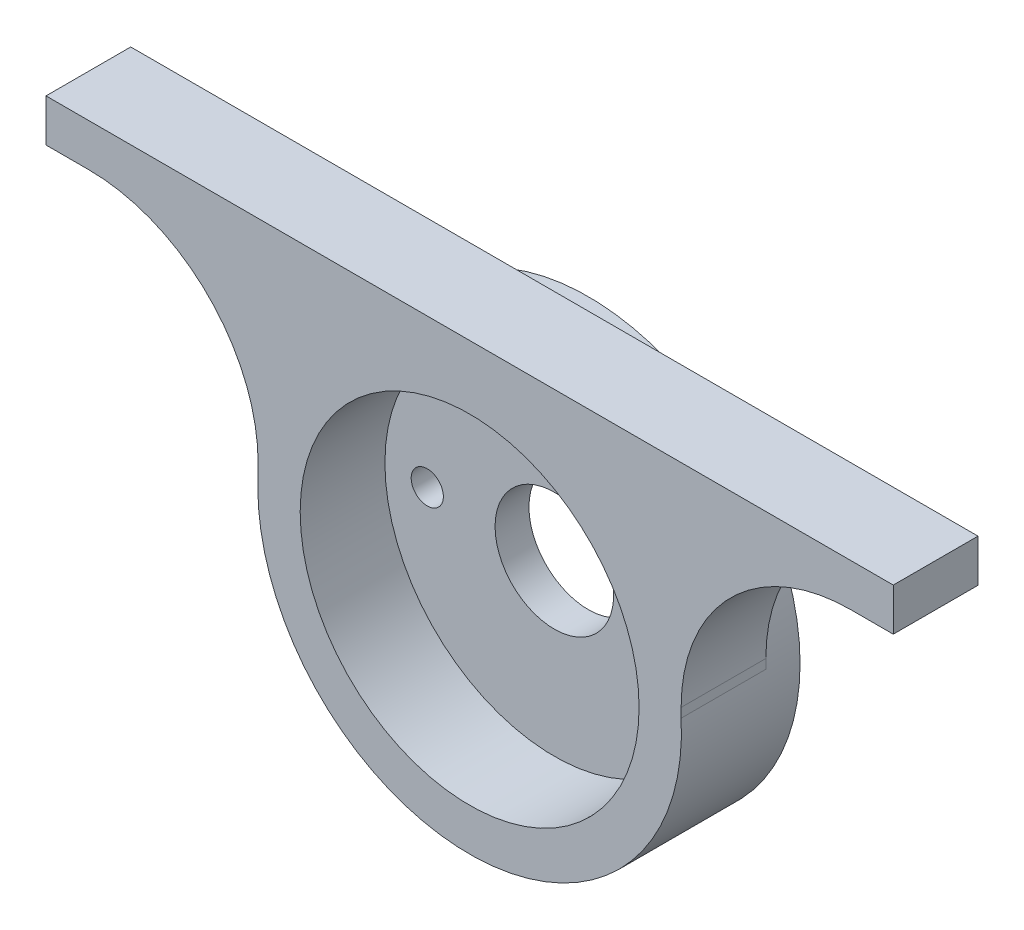
ISO-10303-21;
HEADER;
FILE_DESCRIPTION(('STEP AP214'),'2;1');
FILE_NAME('part.step','',(''),(''),'','','');
FILE_SCHEMA(('AUTOMOTIVE_DESIGN { 1 0 10303 214 1 1 1 1 }'));
ENDSEC;
DATA;
#1=APPLICATION_CONTEXT('core data for automotive mechanical design processes');
#2=APPLICATION_PROTOCOL_DEFINITION('international standard','automotive_design',2000,#1);
#3=PRODUCT_CONTEXT('',#1,'mechanical');
#4=PRODUCT('Part','Part','',(#3));
#5=PRODUCT_RELATED_PRODUCT_CATEGORY('part','',(#4));
#6=PRODUCT_DEFINITION_FORMATION('','',#4);
#7=PRODUCT_DEFINITION_CONTEXT('part definition',#1,'design');
#8=PRODUCT_DEFINITION('design','',#6,#7);
#9=PRODUCT_DEFINITION_SHAPE('','',#8);
#10=(LENGTH_UNIT() NAMED_UNIT(*) SI_UNIT(.MILLI.,.METRE.));
#11=(NAMED_UNIT(*) PLANE_ANGLE_UNIT() SI_UNIT($,.RADIAN.));
#12=(NAMED_UNIT(*) SI_UNIT($,.STERADIAN.) SOLID_ANGLE_UNIT());
#13=UNCERTAINTY_MEASURE_WITH_UNIT(LENGTH_MEASURE(1.E-05),#10,'distance_accuracy_value','');
#14=(GEOMETRIC_REPRESENTATION_CONTEXT(3) GLOBAL_UNCERTAINTY_ASSIGNED_CONTEXT((#13)) GLOBAL_UNIT_ASSIGNED_CONTEXT((#10,
#11,#12)) REPRESENTATION_CONTEXT('',''));
#15=CARTESIAN_POINT('',(0.,0.,0.));
#16=DIRECTION('',(0.,0.,1.));
#17=DIRECTION('',(1.,0.,0.));
#18=AXIS2_PLACEMENT_3D('',#15,#16,#17);
#19=CARTESIAN_POINT('',(-22.4808988706862,1.24338624338623,0.));
#20=DIRECTION('',(0.,0.,1.));
#21=DIRECTION('',(1.,0.,0.));
#22=AXIS2_PLACEMENT_3D('',#19,#20,#21);
#23=PLANE('',#22);
#24=CARTESIAN_POINT('',(0.,0.,0.));
#25=DIRECTION('',(0.,0.,-1.));
#26=DIRECTION('',(-1.,0.,0.));
#27=AXIS2_PLACEMENT_3D('',#24,#25,#26);
#28=CIRCLE('',#27,12.5);
#29=CARTESIAN_POINT('',(-12.4808988706862,0.690770135214576,0.));
#30=VERTEX_POINT('',#29);
#31=CARTESIAN_POINT('',(12.4808988706862,0.690770135214574,0.));
#32=VERTEX_POINT('',#31);
#33=EDGE_CURVE('E250',#30,#32,#28,.T.);
#34=ORIENTED_EDGE('',*,*,#33,.F.);
#35=DIRECTION('',(0.,-1.,0.));
#36=VECTOR('',#35,1.);
#37=CARTESIAN_POINT('',(-12.4808988706862,0.690770135214576,0.));
#38=LINE('',#37,#36);
#39=CARTESIAN_POINT('',(-12.4808988706862,1.24338624338623,0.));
#40=VERTEX_POINT('',#39);
#41=EDGE_CURVE('E170',#40,#30,#38,.T.);
#42=ORIENTED_EDGE('',*,*,#41,.F.);
#43=CARTESIAN_POINT('',(-22.4808988706862,1.24338624338623,0.));
#44=DIRECTION('',(0.,0.,-1.));
#45=DIRECTION('',(1.,0.,0.));
#46=AXIS2_PLACEMENT_3D('',#43,#44,#45);
#47=CIRCLE('',#46,10.);
#48=CARTESIAN_POINT('',(-22.4808988706862,11.2433862433862,0.));
#49=VERTEX_POINT('',#48);
#50=EDGE_CURVE('E167',#49,#40,#47,.T.);
#51=ORIENTED_EDGE('',*,*,#50,.F.);
#52=DIRECTION('',(1.,0.,0.));
#53=VECTOR('',#52,1.);
#54=CARTESIAN_POINT('',(-22.4808988706862,11.2433862433862,0.));
#55=LINE('',#54,#53);
#56=CARTESIAN_POINT('',(-25.,11.2433862433862,0.));
#57=VERTEX_POINT('',#56);
#58=EDGE_CURVE('E164',#57,#49,#55,.T.);
#59=ORIENTED_EDGE('',*,*,#58,.F.);
#60=DIRECTION('',(0.,-1.,0.));
#61=VECTOR('',#60,1.);
#62=CARTESIAN_POINT('',(-25.,11.2433862433862,0.));
#63=LINE('',#62,#61);
#64=CARTESIAN_POINT('',(-25.,13.7566137566138,0.));
#65=VERTEX_POINT('',#64);
#66=EDGE_CURVE('E161',#65,#57,#63,.T.);
#67=ORIENTED_EDGE('',*,*,#66,.F.);
#68=DIRECTION('',(-1.,0.,0.));
#69=VECTOR('',#68,1.);
#70=CARTESIAN_POINT('',(-25.,13.7566137566138,0.));
#71=LINE('',#70,#69);
#72=CARTESIAN_POINT('',(25.,13.7566137566138,0.));
#73=VERTEX_POINT('',#72);
#74=EDGE_CURVE('E157',#73,#65,#71,.T.);
#75=ORIENTED_EDGE('',*,*,#74,.F.);
#76=DIRECTION('',(0.,1.,0.));
#77=VECTOR('',#76,1.);
#78=CARTESIAN_POINT('',(25.,11.2433862433862,0.));
#79=LINE('',#78,#77);
#80=CARTESIAN_POINT('',(25.,11.2433862433862,0.));
#81=VERTEX_POINT('',#80);
#82=EDGE_CURVE('E153',#81,#73,#79,.T.);
#83=ORIENTED_EDGE('',*,*,#82,.F.);
#84=DIRECTION('',(1.,0.,0.));
#85=VECTOR('',#84,1.);
#86=CARTESIAN_POINT('',(25.,11.2433862433862,0.));
#87=LINE('',#86,#85);
#88=CARTESIAN_POINT('',(22.4808988706862,11.2433862433862,0.));
#89=VERTEX_POINT('',#88);
#90=EDGE_CURVE('E96',#89,#81,#87,.T.);
#91=ORIENTED_EDGE('',*,*,#90,.F.);
#92=CARTESIAN_POINT('',(22.4808988706862,1.24338624338624,0.));
#93=DIRECTION('',(0.,0.,-1.));
#94=DIRECTION('',(1.,0.,0.));
#95=AXIS2_PLACEMENT_3D('',#92,#93,#94);
#96=CIRCLE('',#95,10.);
#97=CARTESIAN_POINT('',(12.4808988706862,1.24338624338624,0.));
#98=VERTEX_POINT('',#97);
#99=EDGE_CURVE('E90',#98,#89,#96,.T.);
#100=ORIENTED_EDGE('',*,*,#99,.F.);
#101=DIRECTION('',(0.,1.,0.));
#102=VECTOR('',#101,1.);
#103=CARTESIAN_POINT('',(12.4808988706862,1.24338624338624,0.));
#104=LINE('',#103,#102);
#105=EDGE_CURVE('E140',#32,#98,#104,.T.);
#106=ORIENTED_EDGE('',*,*,#105,.F.);
#107=EDGE_LOOP('',(#34,#42,#51,#59,#67,#75,#83,#91,#100,#106));
#108=FACE_BOUND('',#107,.T.);
#109=ADVANCED_FACE('F39',(#108),#23,.F.);
#110=CARTESIAN_POINT('',(-22.4808988706862,1.24338624338623,5.));
#111=DIRECTION('',(0.,0.,1.));
#112=DIRECTION('',(1.,0.,0.));
#113=AXIS2_PLACEMENT_3D('',#110,#111,#112);
#114=PLANE('',#113);
#115=DIRECTION('',(0.,1.,0.));
#116=VECTOR('',#115,1.);
#117=CARTESIAN_POINT('',(25.,11.2433862433862,5.));
#118=LINE('',#117,#116);
#119=CARTESIAN_POINT('',(25.,11.2433862433862,5.));
#120=VERTEX_POINT('',#119);
#121=CARTESIAN_POINT('',(25.,13.7566137566138,5.));
#122=VERTEX_POINT('',#121);
#123=EDGE_CURVE('E180',#120,#122,#118,.T.);
#124=ORIENTED_EDGE('',*,*,#123,.T.);
#125=DIRECTION('',(-1.,0.,0.));
#126=VECTOR('',#125,1.);
#127=CARTESIAN_POINT('',(-25.,13.7566137566138,5.));
#128=LINE('',#127,#126);
#129=CARTESIAN_POINT('',(-25.,13.7566137566138,5.));
#130=VERTEX_POINT('',#129);
#131=EDGE_CURVE('E104',#122,#130,#128,.T.);
#132=ORIENTED_EDGE('',*,*,#131,.T.);
#133=DIRECTION('',(0.,-1.,0.));
#134=VECTOR('',#133,1.);
#135=CARTESIAN_POINT('',(-25.,11.2433862433862,5.));
#136=LINE('',#135,#134);
#137=CARTESIAN_POINT('',(-25.,11.2433862433862,5.));
#138=VERTEX_POINT('',#137);
#139=EDGE_CURVE('E209',#130,#138,#136,.T.);
#140=ORIENTED_EDGE('',*,*,#139,.T.);
#141=DIRECTION('',(1.,0.,0.));
#142=VECTOR('',#141,1.);
#143=CARTESIAN_POINT('',(-22.4808988706862,11.2433862433862,5.));
#144=LINE('',#143,#142);
#145=CARTESIAN_POINT('',(-22.4808988706862,11.2433862433862,5.));
#146=VERTEX_POINT('',#145);
#147=EDGE_CURVE('E228',#138,#146,#144,.T.);
#148=ORIENTED_EDGE('',*,*,#147,.T.);
#149=CARTESIAN_POINT('',(-22.4808988706862,1.24338624338623,5.));
#150=DIRECTION('',(0.,0.,-1.));
#151=DIRECTION('',(1.,0.,0.));
#152=AXIS2_PLACEMENT_3D('',#149,#150,#151);
#153=CIRCLE('',#152,10.);
#154=CARTESIAN_POINT('',(-12.4808988706862,1.24338624338623,5.));
#155=VERTEX_POINT('',#154);
#156=EDGE_CURVE('E224',#146,#155,#153,.T.);
#157=ORIENTED_EDGE('',*,*,#156,.T.);
#158=DIRECTION('',(0.,-1.,0.));
#159=VECTOR('',#158,1.);
#160=CARTESIAN_POINT('',(-12.4808988706862,0.690770135214576,5.));
#161=LINE('',#160,#159);
#162=CARTESIAN_POINT('',(-12.4808988706862,0.690770135214576,5.));
#163=VERTEX_POINT('',#162);
#164=EDGE_CURVE('E227',#155,#163,#161,.T.);
#165=ORIENTED_EDGE('',*,*,#164,.T.);
#166=CARTESIAN_POINT('',(0.,0.,5.));
#167=DIRECTION('',(0.,0.,1.));
#168=DIRECTION('',(1.,0.,0.));
#169=AXIS2_PLACEMENT_3D('',#166,#167,#168);
#170=CIRCLE('',#169,12.5);
#171=CARTESIAN_POINT('',(12.4808988706862,0.690770135214574,5.));
#172=VERTEX_POINT('',#171);
#173=EDGE_CURVE('E131',#163,#172,#170,.T.);
#174=ORIENTED_EDGE('',*,*,#173,.T.);
#175=DIRECTION('',(0.,1.,0.));
#176=VECTOR('',#175,1.);
#177=CARTESIAN_POINT('',(12.4808988706862,1.24338624338624,5.));
#178=LINE('',#177,#176);
#179=CARTESIAN_POINT('',(12.4808988706862,1.24338624338624,5.));
#180=VERTEX_POINT('',#179);
#181=EDGE_CURVE('E124',#172,#180,#178,.T.);
#182=ORIENTED_EDGE('',*,*,#181,.T.);
#183=CARTESIAN_POINT('',(22.4808988706862,1.24338624338624,5.));
#184=DIRECTION('',(0.,0.,-1.));
#185=DIRECTION('',(1.,0.,0.));
#186=AXIS2_PLACEMENT_3D('',#183,#184,#185);
#187=CIRCLE('',#186,10.);
#188=CARTESIAN_POINT('',(22.4808988706862,11.2433862433862,5.));
#189=VERTEX_POINT('',#188);
#190=EDGE_CURVE('E129',#180,#189,#187,.T.);
#191=ORIENTED_EDGE('',*,*,#190,.T.);
#192=DIRECTION('',(1.,0.,0.));
#193=VECTOR('',#192,1.);
#194=CARTESIAN_POINT('',(25.,11.2433862433862,5.));
#195=LINE('',#194,#193);
#196=EDGE_CURVE('E57',#189,#120,#195,.T.);
#197=ORIENTED_EDGE('',*,*,#196,.T.);
#198=EDGE_LOOP('',(#124,#132,#140,#148,#157,#165,#174,#182,#191,#197));
#199=FACE_BOUND('',#198,.T.);
#200=CARTESIAN_POINT('',(0.,0.,5.));
#201=DIRECTION('',(0.,0.,1.));
#202=DIRECTION('',(1.,0.,0.));
#203=AXIS2_PLACEMENT_3D('',#200,#201,#202);
#204=CIRCLE('',#203,10.);
#205=CARTESIAN_POINT('',(10.,0.,5.));
#206=VERTEX_POINT('',#205);
#207=EDGE_CURVE('E158',#206,#206,#204,.T.);
#208=ORIENTED_EDGE('',*,*,#207,.F.);
#209=EDGE_LOOP('',(#208));
#210=FACE_BOUND('',#209,.T.);
#211=ADVANCED_FACE('F126',(#199,#210),#114,.T.);
#212=CARTESIAN_POINT('',(25.,11.2433862433862,5.));
#213=DIRECTION('',(-1.,0.,0.));
#214=DIRECTION('',(0.,0.,1.));
#215=AXIS2_PLACEMENT_3D('',#212,#213,#214);
#216=PLANE('',#215);
#217=ORIENTED_EDGE('',*,*,#82,.T.);
#218=DIRECTION('',(0.,0.,-1.));
#219=VECTOR('',#218,1.);
#220=CARTESIAN_POINT('',(25.,13.7566137566138,5.));
#221=LINE('',#220,#219);
#222=EDGE_CURVE('E11',#122,#73,#221,.T.);
#223=ORIENTED_EDGE('',*,*,#222,.F.);
#224=ORIENTED_EDGE('',*,*,#123,.F.);
#225=DIRECTION('',(0.,0.,-1.));
#226=VECTOR('',#225,1.);
#227=CARTESIAN_POINT('',(25.,11.2433862433862,5.));
#228=LINE('',#227,#226);
#229=EDGE_CURVE('E149',#120,#81,#228,.T.);
#230=ORIENTED_EDGE('',*,*,#229,.T.);
#231=EDGE_LOOP('',(#217,#223,#224,#230));
#232=FACE_BOUND('',#231,.T.);
#233=ADVANCED_FACE('F41',(#232),#216,.F.);
#234=CARTESIAN_POINT('',(-25.,13.7566137566138,5.));
#235=DIRECTION('',(0.,-1.,0.));
#236=DIRECTION('',(0.,0.,-1.));
#237=AXIS2_PLACEMENT_3D('',#234,#235,#236);
#238=PLANE('',#237);
#239=ORIENTED_EDGE('',*,*,#74,.T.);
#240=DIRECTION('',(0.,0.,-1.));
#241=VECTOR('',#240,1.);
#242=CARTESIAN_POINT('',(-25.,13.7566137566138,5.));
#243=LINE('',#242,#241);
#244=EDGE_CURVE('E49',#130,#65,#243,.T.);
#245=ORIENTED_EDGE('',*,*,#244,.F.);
#246=ORIENTED_EDGE('',*,*,#131,.F.);
#247=ORIENTED_EDGE('',*,*,#222,.T.);
#248=EDGE_LOOP('',(#239,#245,#246,#247));
#249=FACE_BOUND('',#248,.T.);
#250=ADVANCED_FACE('F330',(#249),#238,.F.);
#251=CARTESIAN_POINT('',(-25.,11.2433862433862,5.));
#252=DIRECTION('',(1.,0.,0.));
#253=DIRECTION('',(0.,0.,-1.));
#254=AXIS2_PLACEMENT_3D('',#251,#252,#253);
#255=PLANE('',#254);
#256=ORIENTED_EDGE('',*,*,#66,.T.);
#257=DIRECTION('',(0.,0.,-1.));
#258=VECTOR('',#257,1.);
#259=CARTESIAN_POINT('',(-25.,11.2433862433862,5.));
#260=LINE('',#259,#258);
#261=EDGE_CURVE('E199',#138,#57,#260,.T.);
#262=ORIENTED_EDGE('',*,*,#261,.F.);
#263=ORIENTED_EDGE('',*,*,#139,.F.);
#264=ORIENTED_EDGE('',*,*,#244,.T.);
#265=EDGE_LOOP('',(#256,#262,#263,#264));
#266=FACE_BOUND('',#265,.T.);
#267=ADVANCED_FACE('F207',(#266),#255,.F.);
#268=CARTESIAN_POINT('',(-22.4808988706862,11.2433862433862,5.));
#269=DIRECTION('',(0.,1.,0.));
#270=DIRECTION('',(-1.,0.,0.));
#271=AXIS2_PLACEMENT_3D('',#268,#269,#270);
#272=PLANE('',#271);
#273=ORIENTED_EDGE('',*,*,#58,.T.);
#274=DIRECTION('',(0.,0.,-1.));
#275=VECTOR('',#274,1.);
#276=CARTESIAN_POINT('',(-22.4808988706862,11.2433862433862,5.));
#277=LINE('',#276,#275);
#278=EDGE_CURVE('E195',#146,#49,#277,.T.);
#279=ORIENTED_EDGE('',*,*,#278,.F.);
#280=ORIENTED_EDGE('',*,*,#147,.F.);
#281=ORIENTED_EDGE('',*,*,#261,.T.);
#282=EDGE_LOOP('',(#273,#279,#280,#281));
#283=FACE_BOUND('',#282,.T.);
#284=ADVANCED_FACE('F218',(#283),#272,.F.);
#285=CARTESIAN_POINT('',(-22.4808988706862,1.24338624338623,5.));
#286=DIRECTION('',(0.,0.,-1.));
#287=DIRECTION('',(-1.,0.,0.));
#288=AXIS2_PLACEMENT_3D('',#285,#286,#287);
#289=CYLINDRICAL_SURFACE('',#288,10.);
#290=ORIENTED_EDGE('',*,*,#50,.T.);
#291=DIRECTION('',(0.,0.,-1.));
#292=VECTOR('',#291,1.);
#293=CARTESIAN_POINT('',(-12.4808988706862,1.24338624338623,5.));
#294=LINE('',#293,#292);
#295=EDGE_CURVE('E191',#155,#40,#294,.T.);
#296=ORIENTED_EDGE('',*,*,#295,.F.);
#297=ORIENTED_EDGE('',*,*,#156,.F.);
#298=ORIENTED_EDGE('',*,*,#278,.T.);
#299=EDGE_LOOP('',(#290,#296,#297,#298));
#300=FACE_BOUND('',#299,.T.);
#301=ADVANCED_FACE('F222',(#300),#289,.F.);
#302=CARTESIAN_POINT('',(-12.4808988706862,0.690770135214576,5.));
#303=DIRECTION('',(1.,0.,0.));
#304=DIRECTION('',(0.,1.,0.));
#305=AXIS2_PLACEMENT_3D('',#302,#303,#304);
#306=PLANE('',#305);
#307=ORIENTED_EDGE('',*,*,#41,.T.);
#308=DIRECTION('',(0.,0.,-1.));
#309=VECTOR('',#308,1.);
#310=CARTESIAN_POINT('',(-12.4808988706862,0.690770135214576,5.));
#311=LINE('',#310,#309);
#312=EDGE_CURVE('E187',#163,#30,#311,.T.);
#313=ORIENTED_EDGE('',*,*,#312,.F.);
#314=ORIENTED_EDGE('',*,*,#164,.F.);
#315=ORIENTED_EDGE('',*,*,#295,.T.);
#316=EDGE_LOOP('',(#307,#313,#314,#315));
#317=FACE_BOUND('',#316,.T.);
#318=ADVANCED_FACE('F320',(#317),#306,.F.);
#319=CARTESIAN_POINT('',(0.,0.,5.));
#320=DIRECTION('',(0.,0.,-1.));
#321=DIRECTION('',(-1.,0.,0.));
#322=AXIS2_PLACEMENT_3D('',#319,#320,#321);
#323=CYLINDRICAL_SURFACE('',#322,12.5);
#324=ORIENTED_EDGE('',*,*,#312,.T.);
#325=ORIENTED_EDGE('',*,*,#33,.T.);
#326=DIRECTION('',(0.,0.,-1.));
#327=VECTOR('',#326,1.);
#328=CARTESIAN_POINT('',(12.4808988706862,0.690770135214574,5.));
#329=LINE('',#328,#327);
#330=EDGE_CURVE('E142',#172,#32,#329,.T.);
#331=ORIENTED_EDGE('',*,*,#330,.F.);
#332=ORIENTED_EDGE('',*,*,#173,.F.);
#333=EDGE_LOOP('',(#324,#325,#331,#332));
#334=FACE_BOUND('',#333,.T.);
#335=CARTESIAN_POINT('',(0.,0.,-2.));
#336=DIRECTION('',(0.,0.,-1.));
#337=DIRECTION('',(-1.,0.,0.));
#338=AXIS2_PLACEMENT_3D('',#335,#336,#337);
#339=CIRCLE('',#338,12.5);
#340=CARTESIAN_POINT('',(-12.5,0.,-2.));
#341=VERTEX_POINT('',#340);
#342=EDGE_CURVE('E246',#341,#341,#339,.T.);
#343=ORIENTED_EDGE('',*,*,#342,.F.);
#344=EDGE_LOOP('',(#343));
#345=FACE_BOUND('',#344,.T.);
#346=ADVANCED_FACE('F317',(#334,#345),#323,.T.);
#347=CARTESIAN_POINT('',(12.4808988706862,1.24338624338624,5.));
#348=DIRECTION('',(-1.,0.,0.));
#349=DIRECTION('',(0.,-1.,0.));
#350=AXIS2_PLACEMENT_3D('',#347,#348,#349);
#351=PLANE('',#350);
#352=ORIENTED_EDGE('',*,*,#105,.T.);
#353=DIRECTION('',(0.,0.,-1.));
#354=VECTOR('',#353,1.);
#355=CARTESIAN_POINT('',(12.4808988706862,1.24338624338624,5.));
#356=LINE('',#355,#354);
#357=EDGE_CURVE('E137',#180,#98,#356,.T.);
#358=ORIENTED_EDGE('',*,*,#357,.F.);
#359=ORIENTED_EDGE('',*,*,#181,.F.);
#360=ORIENTED_EDGE('',*,*,#330,.T.);
#361=EDGE_LOOP('',(#352,#358,#359,#360));
#362=FACE_BOUND('',#361,.T.);
#363=ADVANCED_FACE('F138',(#362),#351,.F.);
#364=CARTESIAN_POINT('',(22.4808988706862,1.24338624338624,5.));
#365=DIRECTION('',(0.,0.,-1.));
#366=DIRECTION('',(-1.,0.,0.));
#367=AXIS2_PLACEMENT_3D('',#364,#365,#366);
#368=CYLINDRICAL_SURFACE('',#367,10.);
#369=ORIENTED_EDGE('',*,*,#99,.T.);
#370=DIRECTION('',(0.,0.,-1.));
#371=VECTOR('',#370,1.);
#372=CARTESIAN_POINT('',(22.4808988706862,11.2433862433862,5.));
#373=LINE('',#372,#371);
#374=EDGE_CURVE('E143',#189,#89,#373,.T.);
#375=ORIENTED_EDGE('',*,*,#374,.F.);
#376=ORIENTED_EDGE('',*,*,#190,.F.);
#377=ORIENTED_EDGE('',*,*,#357,.T.);
#378=EDGE_LOOP('',(#369,#375,#376,#377));
#379=FACE_BOUND('',#378,.T.);
#380=ADVANCED_FACE('F145',(#379),#368,.F.);
#381=CARTESIAN_POINT('',(25.,11.2433862433862,5.));
#382=DIRECTION('',(0.,1.,0.));
#383=DIRECTION('',(-1.,0.,0.));
#384=AXIS2_PLACEMENT_3D('',#381,#382,#383);
#385=PLANE('',#384);
#386=ORIENTED_EDGE('',*,*,#90,.T.);
#387=ORIENTED_EDGE('',*,*,#229,.F.);
#388=ORIENTED_EDGE('',*,*,#196,.F.);
#389=ORIENTED_EDGE('',*,*,#374,.T.);
#390=EDGE_LOOP('',(#386,#387,#388,#389));
#391=FACE_BOUND('',#390,.T.);
#392=ADVANCED_FACE('F310',(#391),#385,.F.);
#393=CARTESIAN_POINT('',(0.,0.,5.));
#394=DIRECTION('',(0.,0.,-1.));
#395=DIRECTION('',(-1.,0.,0.));
#396=AXIS2_PLACEMENT_3D('',#393,#394,#395);
#397=CYLINDRICAL_SURFACE('',#396,10.);
#398=ORIENTED_EDGE('',*,*,#207,.T.);
#399=EDGE_LOOP('',(#398));
#400=FACE_BOUND('',#399,.T.);
#401=CARTESIAN_POINT('',(0.,0.,0.));
#402=DIRECTION('',(0.,0.,1.));
#403=DIRECTION('',(1.,0.,0.));
#404=AXIS2_PLACEMENT_3D('',#401,#402,#403);
#405=CIRCLE('',#404,10.);
#406=CARTESIAN_POINT('',(10.,0.,0.));
#407=VERTEX_POINT('',#406);
#408=EDGE_CURVE('E242',#407,#407,#405,.T.);
#409=ORIENTED_EDGE('',*,*,#408,.F.);
#410=EDGE_LOOP('',(#409));
#411=FACE_BOUND('',#410,.T.);
#412=ADVANCED_FACE('F297',(#400,#411),#397,.F.);
#413=CARTESIAN_POINT('',(0.,0.,0.));
#414=DIRECTION('',(0.,0.,-1.));
#415=DIRECTION('',(-1.,0.,0.));
#416=AXIS2_PLACEMENT_3D('',#413,#414,#415);
#417=PLANE('',#416);
#418=CARTESIAN_POINT('',(7.5,0.,0.));
#419=DIRECTION('',(0.,0.,-1.));
#420=DIRECTION('',(-1.,0.,0.));
#421=AXIS2_PLACEMENT_3D('',#418,#419,#420);
#422=CIRCLE('',#421,0.95);
#423=CARTESIAN_POINT('',(6.55,0.,0.));
#424=VERTEX_POINT('',#423);
#425=EDGE_CURVE('E273',#424,#424,#422,.T.);
#426=ORIENTED_EDGE('',*,*,#425,.T.);
#427=EDGE_LOOP('',(#426));
#428=FACE_BOUND('',#427,.T.);
#429=CARTESIAN_POINT('',(-7.5,0.,0.));
#430=DIRECTION('',(0.,0.,-1.));
#431=DIRECTION('',(-1.,0.,0.));
#432=AXIS2_PLACEMENT_3D('',#429,#430,#431);
#433=CIRCLE('',#432,0.949999999999997);
#434=CARTESIAN_POINT('',(-8.45,0.,0.));
#435=VERTEX_POINT('',#434);
#436=EDGE_CURVE('E265',#435,#435,#433,.T.);
#437=ORIENTED_EDGE('',*,*,#436,.T.);
#438=EDGE_LOOP('',(#437));
#439=FACE_BOUND('',#438,.T.);
#440=CARTESIAN_POINT('',(0.,0.,0.));
#441=DIRECTION('',(0.,0.,-1.));
#442=DIRECTION('',(-1.,0.,0.));
#443=AXIS2_PLACEMENT_3D('',#440,#441,#442);
#444=CIRCLE('',#443,3.5);
#445=CARTESIAN_POINT('',(-3.5,0.,0.));
#446=VERTEX_POINT('',#445);
#447=EDGE_CURVE('E257',#446,#446,#444,.T.);
#448=ORIENTED_EDGE('',*,*,#447,.T.);
#449=EDGE_LOOP('',(#448));
#450=FACE_BOUND('',#449,.T.);
#451=ORIENTED_EDGE('',*,*,#408,.T.);
#452=EDGE_LOOP('',(#451));
#453=FACE_BOUND('',#452,.T.);
#454=ADVANCED_FACE('F287',(#428,#439,#450,#453),#417,.F.);
#455=CARTESIAN_POINT('',(0.,0.,-2.));
#456=DIRECTION('',(0.,0.,-1.));
#457=DIRECTION('',(-1.,0.,0.));
#458=AXIS2_PLACEMENT_3D('',#455,#456,#457);
#459=PLANE('',#458);
#460=CARTESIAN_POINT('',(-7.5,0.,-2.));
#461=DIRECTION('',(0.,0.,-1.));
#462=DIRECTION('',(-1.,0.,0.));
#463=AXIS2_PLACEMENT_3D('',#460,#461,#462);
#464=CIRCLE('',#463,0.949999999999997);
#465=CARTESIAN_POINT('',(-8.45,0.,-2.));
#466=VERTEX_POINT('',#465);
#467=EDGE_CURVE('E261',#466,#466,#464,.T.);
#468=ORIENTED_EDGE('',*,*,#467,.F.);
#469=EDGE_LOOP('',(#468));
#470=FACE_BOUND('',#469,.T.);
#471=ORIENTED_EDGE('',*,*,#342,.T.);
#472=EDGE_LOOP('',(#471));
#473=FACE_BOUND('',#472,.T.);
#474=CARTESIAN_POINT('',(0.,0.,-2.));
#475=DIRECTION('',(0.,0.,-1.));
#476=DIRECTION('',(-1.,0.,0.));
#477=AXIS2_PLACEMENT_3D('',#474,#475,#476);
#478=CIRCLE('',#477,3.5);
#479=CARTESIAN_POINT('',(-3.5,0.,-2.));
#480=VERTEX_POINT('',#479);
#481=EDGE_CURVE('E253',#480,#480,#478,.T.);
#482=ORIENTED_EDGE('',*,*,#481,.F.);
#483=EDGE_LOOP('',(#482));
#484=FACE_BOUND('',#483,.T.);
#485=CARTESIAN_POINT('',(7.5,0.,-2.));
#486=DIRECTION('',(0.,0.,-1.));
#487=DIRECTION('',(-1.,0.,0.));
#488=AXIS2_PLACEMENT_3D('',#485,#486,#487);
#489=CIRCLE('',#488,0.95);
#490=CARTESIAN_POINT('',(6.55,0.,-2.));
#491=VERTEX_POINT('',#490);
#492=EDGE_CURVE('E269',#491,#491,#489,.T.);
#493=ORIENTED_EDGE('',*,*,#492,.F.);
#494=EDGE_LOOP('',(#493));
#495=FACE_BOUND('',#494,.T.);
#496=ADVANCED_FACE('F284',(#470,#473,#484,#495),#459,.T.);
#497=CARTESIAN_POINT('',(0.,0.,-2.));
#498=DIRECTION('',(0.,0.,1.));
#499=DIRECTION('',(1.,0.,0.));
#500=AXIS2_PLACEMENT_3D('',#497,#498,#499);
#501=CYLINDRICAL_SURFACE('',#500,3.5);
#502=ORIENTED_EDGE('',*,*,#481,.T.);
#503=EDGE_LOOP('',(#502));
#504=FACE_BOUND('',#503,.T.);
#505=ORIENTED_EDGE('',*,*,#447,.F.);
#506=EDGE_LOOP('',(#505));
#507=FACE_BOUND('',#506,.T.);
#508=ADVANCED_FACE('F286',(#504,#507),#501,.F.);
#509=CARTESIAN_POINT('',(-7.5,0.,-2.));
#510=DIRECTION('',(0.,0.,1.));
#511=DIRECTION('',(1.,0.,0.));
#512=AXIS2_PLACEMENT_3D('',#509,#510,#511);
#513=CYLINDRICAL_SURFACE('',#512,0.949999999999997);
#514=ORIENTED_EDGE('',*,*,#467,.T.);
#515=EDGE_LOOP('',(#514));
#516=FACE_BOUND('',#515,.T.);
#517=ORIENTED_EDGE('',*,*,#436,.F.);
#518=EDGE_LOOP('',(#517));
#519=FACE_BOUND('',#518,.T.);
#520=ADVANCED_FACE('F294',(#516,#519),#513,.F.);
#521=CARTESIAN_POINT('',(7.5,0.,-2.));
#522=DIRECTION('',(0.,0.,1.));
#523=DIRECTION('',(1.,0.,0.));
#524=AXIS2_PLACEMENT_3D('',#521,#522,#523);
#525=CYLINDRICAL_SURFACE('',#524,0.95);
#526=ORIENTED_EDGE('',*,*,#492,.T.);
#527=EDGE_LOOP('',(#526));
#528=FACE_BOUND('',#527,.T.);
#529=ORIENTED_EDGE('',*,*,#425,.F.);
#530=EDGE_LOOP('',(#529));
#531=FACE_BOUND('',#530,.T.);
#532=ADVANCED_FACE('F281',(#528,#531),#525,.F.);
#533=CLOSED_SHELL('',(#109,#211,#233,#250,#267,#284,#301,#318,#346,#363,#380,#392,#412,#454,
#496,#508,#520,#532));
#534=MANIFOLD_SOLID_BREP('B2',#533);
#535=ADVANCED_BREP_SHAPE_REPRESENTATION('',(#18,#534),#14);
#536=SHAPE_DEFINITION_REPRESENTATION(#9,#535);
ENDSEC;
END-ISO-10303-21;
